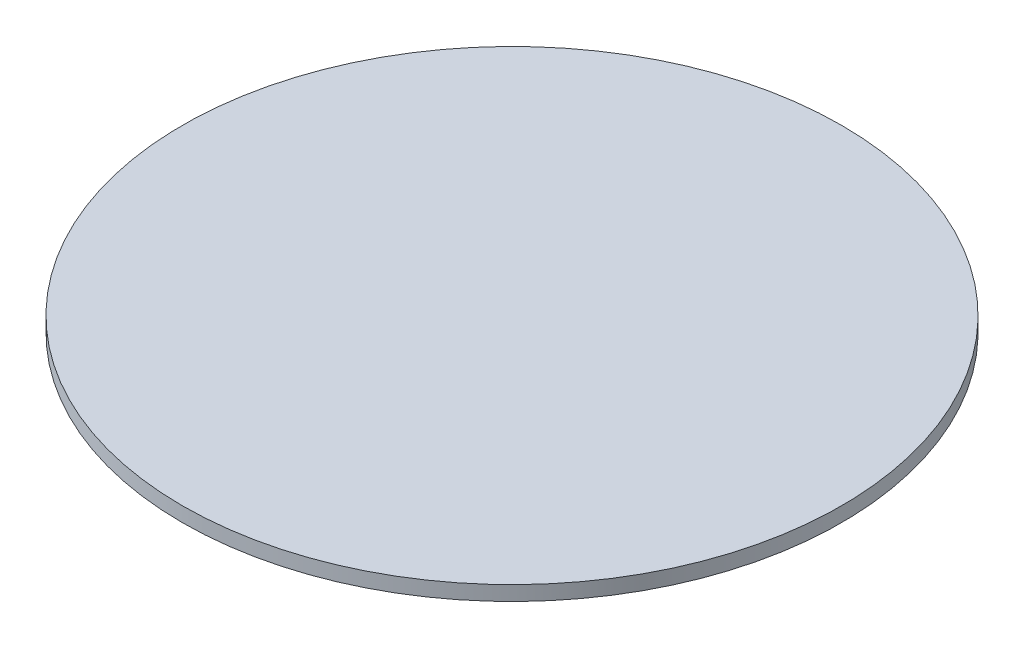
ISO-10303-21;
HEADER;
FILE_DESCRIPTION(('STEP AP214'),'2;1');
FILE_NAME('part.step','',(''),(''),'','','');
FILE_SCHEMA(('AUTOMOTIVE_DESIGN { 1 0 10303 214 1 1 1 1 }'));
ENDSEC;
DATA;
#1=APPLICATION_CONTEXT('core data for automotive mechanical design processes');
#2=APPLICATION_PROTOCOL_DEFINITION('international standard','automotive_design',2000,#1);
#3=PRODUCT_CONTEXT('',#1,'mechanical');
#4=PRODUCT('Part','Part','',(#3));
#5=PRODUCT_RELATED_PRODUCT_CATEGORY('part','',(#4));
#6=PRODUCT_DEFINITION_FORMATION('','',#4);
#7=PRODUCT_DEFINITION_CONTEXT('part definition',#1,'design');
#8=PRODUCT_DEFINITION('design','',#6,#7);
#9=PRODUCT_DEFINITION_SHAPE('','',#8);
#10=(LENGTH_UNIT() NAMED_UNIT(*) SI_UNIT(.MILLI.,.METRE.));
#11=(NAMED_UNIT(*) PLANE_ANGLE_UNIT() SI_UNIT($,.RADIAN.));
#12=(NAMED_UNIT(*) SI_UNIT($,.STERADIAN.) SOLID_ANGLE_UNIT());
#13=UNCERTAINTY_MEASURE_WITH_UNIT(LENGTH_MEASURE(1.E-05),#10,'distance_accuracy_value','');
#14=(GEOMETRIC_REPRESENTATION_CONTEXT(3) GLOBAL_UNCERTAINTY_ASSIGNED_CONTEXT((#13)) GLOBAL_UNIT_ASSIGNED_CONTEXT((#10,
#11,#12)) REPRESENTATION_CONTEXT('',''));
#15=CARTESIAN_POINT('',(0.,0.,0.));
#16=DIRECTION('',(0.,0.,1.));
#17=DIRECTION('',(1.,0.,0.));
#18=AXIS2_PLACEMENT_3D('',#15,#16,#17);
#19=CARTESIAN_POINT('',(0.,2.,0.));
#20=DIRECTION('',(0.,-1.,0.));
#21=DIRECTION('',(0.,0.,-1.));
#22=AXIS2_PLACEMENT_3D('',#19,#20,#21);
#23=CYLINDRICAL_SURFACE('',#22,44.9999999999999);
#24=CARTESIAN_POINT('',(0.,2.,0.));
#25=DIRECTION('',(0.,1.,0.));
#26=DIRECTION('',(0.,0.,1.));
#27=AXIS2_PLACEMENT_3D('',#24,#25,#26);
#28=CIRCLE('',#27,44.9999999999999);
#29=CARTESIAN_POINT('',(0.,2.,44.9999999999999));
#30=VERTEX_POINT('',#29);
#31=EDGE_CURVE('E10',#30,#30,#28,.T.);
#32=ORIENTED_EDGE('',*,*,#31,.F.);
#33=EDGE_LOOP('',(#32));
#34=FACE_BOUND('',#33,.T.);
#35=CARTESIAN_POINT('',(0.,0.,0.));
#36=DIRECTION('',(0.,1.,0.));
#37=DIRECTION('',(0.,0.,1.));
#38=AXIS2_PLACEMENT_3D('',#35,#36,#37);
#39=CIRCLE('',#38,44.9999999999999);
#40=CARTESIAN_POINT('',(0.,0.,44.9999999999999));
#41=VERTEX_POINT('',#40);
#42=EDGE_CURVE('E34',#41,#41,#39,.T.);
#43=ORIENTED_EDGE('',*,*,#42,.T.);
#44=EDGE_LOOP('',(#43));
#45=FACE_BOUND('',#44,.T.);
#46=ADVANCED_FACE('F31',(#34,#45),#23,.T.);
#47=CARTESIAN_POINT('',(0.,2.,0.));
#48=DIRECTION('',(0.,1.,0.));
#49=DIRECTION('',(0.,0.,1.));
#50=AXIS2_PLACEMENT_3D('',#47,#48,#49);
#51=PLANE('',#50);
#52=ORIENTED_EDGE('',*,*,#31,.T.);
#53=EDGE_LOOP('',(#52));
#54=FACE_BOUND('',#53,.T.);
#55=ADVANCED_FACE('F46',(#54),#51,.T.);
#56=CARTESIAN_POINT('',(0.,0.,0.));
#57=DIRECTION('',(0.,1.,0.));
#58=DIRECTION('',(0.,0.,1.));
#59=AXIS2_PLACEMENT_3D('',#56,#57,#58);
#60=PLANE('',#59);
#61=ORIENTED_EDGE('',*,*,#42,.F.);
#62=EDGE_LOOP('',(#61));
#63=FACE_BOUND('',#62,.T.);
#64=ADVANCED_FACE('F44',(#63),#60,.F.);
#65=CLOSED_SHELL('',(#46,#55,#64));
#66=MANIFOLD_SOLID_BREP('B2',#65);
#67=ADVANCED_BREP_SHAPE_REPRESENTATION('',(#18,#66),#14);
#68=SHAPE_DEFINITION_REPRESENTATION(#9,#67);
ENDSEC;
END-ISO-10303-21;
